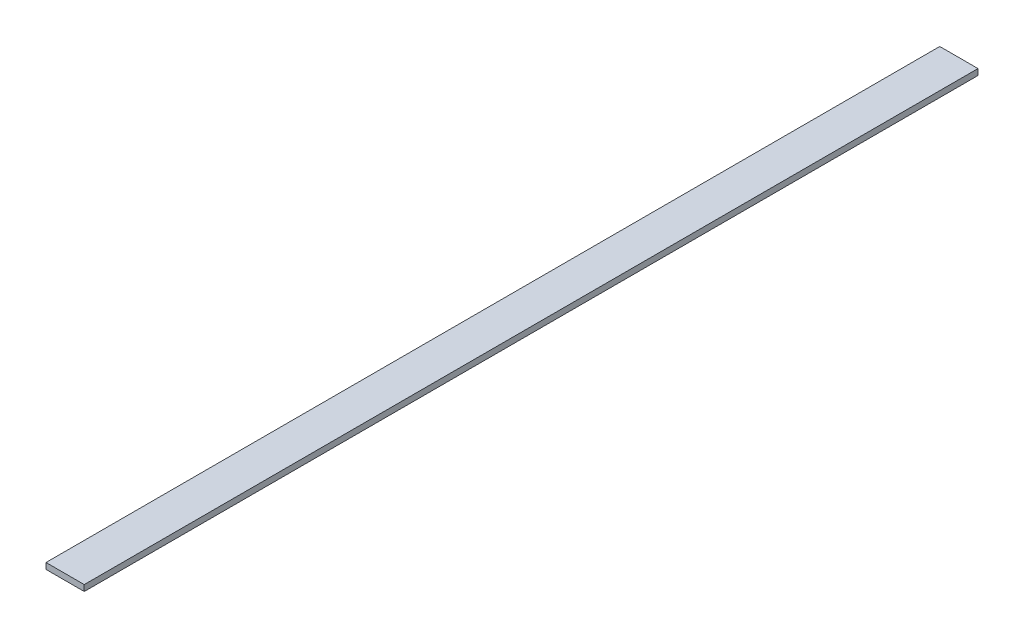
ISO-10303-21;
HEADER;
FILE_DESCRIPTION(('STEP AP214'),'2;1');
FILE_NAME('part.step','',(''),(''),'','','');
FILE_SCHEMA(('AUTOMOTIVE_DESIGN { 1 0 10303 214 1 1 1 1 }'));
ENDSEC;
DATA;
#1=APPLICATION_CONTEXT('core data for automotive mechanical design processes');
#2=APPLICATION_PROTOCOL_DEFINITION('international standard','automotive_design',2000,#1);
#3=PRODUCT_CONTEXT('',#1,'mechanical');
#4=PRODUCT('Part','Part','',(#3));
#5=PRODUCT_RELATED_PRODUCT_CATEGORY('part','',(#4));
#6=PRODUCT_DEFINITION_FORMATION('','',#4);
#7=PRODUCT_DEFINITION_CONTEXT('part definition',#1,'design');
#8=PRODUCT_DEFINITION('design','',#6,#7);
#9=PRODUCT_DEFINITION_SHAPE('','',#8);
#10=(LENGTH_UNIT() NAMED_UNIT(*) SI_UNIT(.MILLI.,.METRE.));
#11=(NAMED_UNIT(*) PLANE_ANGLE_UNIT() SI_UNIT($,.RADIAN.));
#12=(NAMED_UNIT(*) SI_UNIT($,.STERADIAN.) SOLID_ANGLE_UNIT());
#13=UNCERTAINTY_MEASURE_WITH_UNIT(LENGTH_MEASURE(1.E-05),#10,'distance_accuracy_value','');
#14=(GEOMETRIC_REPRESENTATION_CONTEXT(3) GLOBAL_UNCERTAINTY_ASSIGNED_CONTEXT((#13)) GLOBAL_UNIT_ASSIGNED_CONTEXT((#10,
#11,#12)) REPRESENTATION_CONTEXT('',''));
#15=CARTESIAN_POINT('',(0.,0.,0.));
#16=DIRECTION('',(0.,0.,1.));
#17=DIRECTION('',(1.,0.,0.));
#18=AXIS2_PLACEMENT_3D('',#15,#16,#17);
#19=CARTESIAN_POINT('',(9.5,3.,222.));
#20=DIRECTION('',(-1.,0.,0.));
#21=DIRECTION('',(0.,0.,1.));
#22=AXIS2_PLACEMENT_3D('',#19,#20,#21);
#23=PLANE('',#22);
#24=DIRECTION('',(0.,0.,-1.));
#25=VECTOR('',#24,1.);
#26=CARTESIAN_POINT('',(9.5,0.,222.));
#27=LINE('',#26,#25);
#28=CARTESIAN_POINT('',(9.5,0.,222.));
#29=VERTEX_POINT('',#28);
#30=CARTESIAN_POINT('',(9.5,0.,-222.));
#31=VERTEX_POINT('',#30);
#32=EDGE_CURVE('E96',#29,#31,#27,.T.);
#33=ORIENTED_EDGE('',*,*,#32,.T.);
#34=DIRECTION('',(0.,-1.,0.));
#35=VECTOR('',#34,1.);
#36=CARTESIAN_POINT('',(9.5,3.,-222.));
#37=LINE('',#36,#35);
#38=CARTESIAN_POINT('',(9.5,3.,-222.));
#39=VERTEX_POINT('',#38);
#40=EDGE_CURVE('E11',#39,#31,#37,.T.);
#41=ORIENTED_EDGE('',*,*,#40,.F.);
#42=DIRECTION('',(0.,0.,-1.));
#43=VECTOR('',#42,1.);
#44=CARTESIAN_POINT('',(9.5,3.,222.));
#45=LINE('',#44,#43);
#46=CARTESIAN_POINT('',(9.5,3.,222.));
#47=VERTEX_POINT('',#46);
#48=EDGE_CURVE('E84',#47,#39,#45,.T.);
#49=ORIENTED_EDGE('',*,*,#48,.F.);
#50=DIRECTION('',(0.,-1.,0.));
#51=VECTOR('',#50,1.);
#52=CARTESIAN_POINT('',(9.5,3.,222.));
#53=LINE('',#52,#51);
#54=EDGE_CURVE('E92',#47,#29,#53,.T.);
#55=ORIENTED_EDGE('',*,*,#54,.T.);
#56=EDGE_LOOP('',(#33,#41,#49,#55));
#57=FACE_BOUND('',#56,.T.);
#58=ADVANCED_FACE('F33',(#57),#23,.F.);
#59=CARTESIAN_POINT('',(-9.5,3.,-222.));
#60=DIRECTION('',(0.,0.,1.));
#61=DIRECTION('',(1.,0.,0.));
#62=AXIS2_PLACEMENT_3D('',#59,#60,#61);
#63=PLANE('',#62);
#64=DIRECTION('',(-1.,0.,0.));
#65=VECTOR('',#64,1.);
#66=CARTESIAN_POINT('',(-9.5,0.,-222.));
#67=LINE('',#66,#65);
#68=CARTESIAN_POINT('',(-9.5,0.,-222.));
#69=VERTEX_POINT('',#68);
#70=EDGE_CURVE('E88',#31,#69,#67,.T.);
#71=ORIENTED_EDGE('',*,*,#70,.T.);
#72=DIRECTION('',(0.,-1.,0.));
#73=VECTOR('',#72,1.);
#74=CARTESIAN_POINT('',(-9.5,3.,-222.));
#75=LINE('',#74,#73);
#76=CARTESIAN_POINT('',(-9.5,3.,-222.));
#77=VERTEX_POINT('',#76);
#78=EDGE_CURVE('E41',#77,#69,#75,.T.);
#79=ORIENTED_EDGE('',*,*,#78,.F.);
#80=DIRECTION('',(-1.,0.,0.));
#81=VECTOR('',#80,1.);
#82=CARTESIAN_POINT('',(-9.5,3.,-222.));
#83=LINE('',#82,#81);
#84=EDGE_CURVE('E79',#39,#77,#83,.T.);
#85=ORIENTED_EDGE('',*,*,#84,.F.);
#86=ORIENTED_EDGE('',*,*,#40,.T.);
#87=EDGE_LOOP('',(#71,#79,#85,#86));
#88=FACE_BOUND('',#87,.T.);
#89=ADVANCED_FACE('F87',(#88),#63,.F.);
#90=CARTESIAN_POINT('',(-9.5,3.,222.));
#91=DIRECTION('',(1.,0.,0.));
#92=DIRECTION('',(0.,0.,-1.));
#93=AXIS2_PLACEMENT_3D('',#90,#91,#92);
#94=PLANE('',#93);
#95=DIRECTION('',(0.,0.,1.));
#96=VECTOR('',#95,1.);
#97=CARTESIAN_POINT('',(-9.5,0.,222.));
#98=LINE('',#97,#96);
#99=CARTESIAN_POINT('',(-9.5,0.,222.));
#100=VERTEX_POINT('',#99);
#101=EDGE_CURVE('E66',#69,#100,#98,.T.);
#102=ORIENTED_EDGE('',*,*,#101,.T.);
#103=DIRECTION('',(0.,-1.,0.));
#104=VECTOR('',#103,1.);
#105=CARTESIAN_POINT('',(-9.5,3.,222.));
#106=LINE('',#105,#104);
#107=CARTESIAN_POINT('',(-9.5,3.,222.));
#108=VERTEX_POINT('',#107);
#109=EDGE_CURVE('E89',#108,#100,#106,.T.);
#110=ORIENTED_EDGE('',*,*,#109,.F.);
#111=DIRECTION('',(0.,0.,1.));
#112=VECTOR('',#111,1.);
#113=CARTESIAN_POINT('',(-9.5,3.,222.));
#114=LINE('',#113,#112);
#115=EDGE_CURVE('E82',#77,#108,#114,.T.);
#116=ORIENTED_EDGE('',*,*,#115,.F.);
#117=ORIENTED_EDGE('',*,*,#78,.T.);
#118=EDGE_LOOP('',(#102,#110,#116,#117));
#119=FACE_BOUND('',#118,.T.);
#120=ADVANCED_FACE('F90',(#119),#94,.F.);
#121=CARTESIAN_POINT('',(-9.5,3.,222.));
#122=DIRECTION('',(0.,0.,-1.));
#123=DIRECTION('',(-1.,0.,0.));
#124=AXIS2_PLACEMENT_3D('',#121,#122,#123);
#125=PLANE('',#124);
#126=DIRECTION('',(1.,0.,0.));
#127=VECTOR('',#126,1.);
#128=CARTESIAN_POINT('',(-9.5,0.,222.));
#129=LINE('',#128,#127);
#130=EDGE_CURVE('E72',#100,#29,#129,.T.);
#131=ORIENTED_EDGE('',*,*,#130,.T.);
#132=ORIENTED_EDGE('',*,*,#54,.F.);
#133=DIRECTION('',(1.,0.,0.));
#134=VECTOR('',#133,1.);
#135=CARTESIAN_POINT('',(-9.5,3.,222.));
#136=LINE('',#135,#134);
#137=EDGE_CURVE('E49',#108,#47,#136,.T.);
#138=ORIENTED_EDGE('',*,*,#137,.F.);
#139=ORIENTED_EDGE('',*,*,#109,.T.);
#140=EDGE_LOOP('',(#131,#132,#138,#139));
#141=FACE_BOUND('',#140,.T.);
#142=ADVANCED_FACE('F103',(#141),#125,.F.);
#143=CARTESIAN_POINT('',(0.,3.,0.));
#144=DIRECTION('',(0.,-1.,0.));
#145=DIRECTION('',(0.,0.,-1.));
#146=AXIS2_PLACEMENT_3D('',#143,#144,#145);
#147=PLANE('',#146);
#148=ORIENTED_EDGE('',*,*,#48,.T.);
#149=ORIENTED_EDGE('',*,*,#84,.T.);
#150=ORIENTED_EDGE('',*,*,#115,.T.);
#151=ORIENTED_EDGE('',*,*,#137,.T.);
#152=EDGE_LOOP('',(#148,#149,#150,#151));
#153=FACE_BOUND('',#152,.T.);
#154=ADVANCED_FACE('F80',(#153),#147,.F.);
#155=CARTESIAN_POINT('',(0.,0.,0.));
#156=DIRECTION('',(0.,-1.,0.));
#157=DIRECTION('',(0.,0.,-1.));
#158=AXIS2_PLACEMENT_3D('',#155,#156,#157);
#159=PLANE('',#158);
#160=ORIENTED_EDGE('',*,*,#32,.F.);
#161=ORIENTED_EDGE('',*,*,#130,.F.);
#162=ORIENTED_EDGE('',*,*,#101,.F.);
#163=ORIENTED_EDGE('',*,*,#70,.F.);
#164=EDGE_LOOP('',(#160,#161,#162,#163));
#165=FACE_BOUND('',#164,.T.);
#166=ADVANCED_FACE('F106',(#165),#159,.T.);
#167=CLOSED_SHELL('',(#58,#89,#120,#142,#154,#166));
#168=MANIFOLD_SOLID_BREP('B2',#167);
#169=ADVANCED_BREP_SHAPE_REPRESENTATION('',(#18,#168),#14);
#170=SHAPE_DEFINITION_REPRESENTATION(#9,#169);
ENDSEC;
END-ISO-10303-21;
